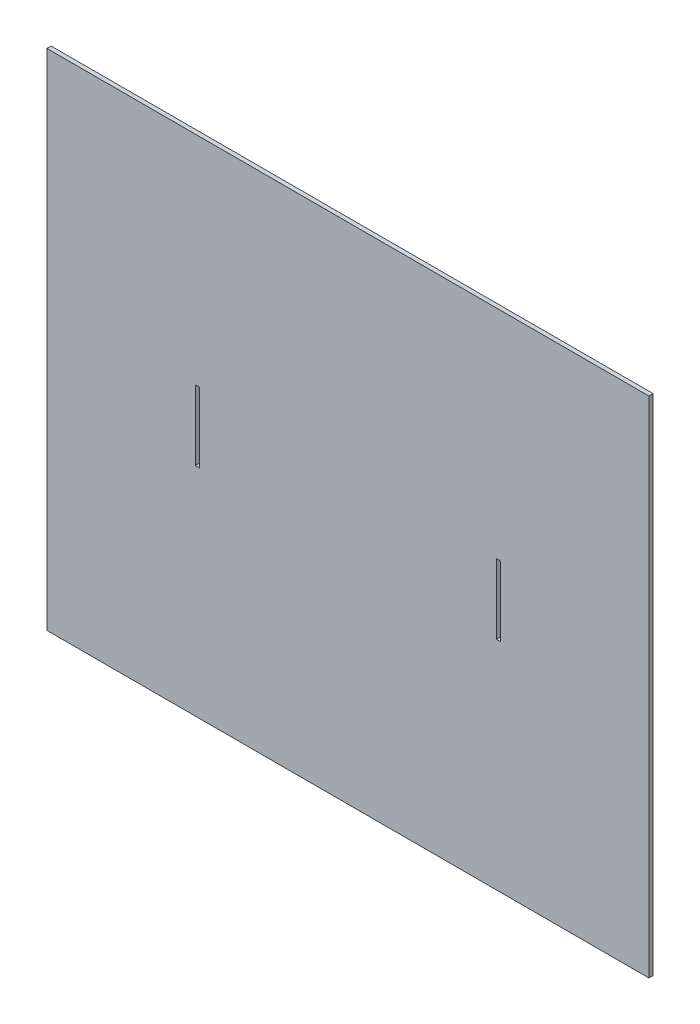
ISO-10303-21;
HEADER;
FILE_DESCRIPTION(('STEP AP214'),'2;1');
FILE_NAME('part.step','',(''),(''),'','','');
FILE_SCHEMA(('AUTOMOTIVE_DESIGN { 1 0 10303 214 1 1 1 1 }'));
ENDSEC;
DATA;
#1=APPLICATION_CONTEXT('core data for automotive mechanical design processes');
#2=APPLICATION_PROTOCOL_DEFINITION('international standard','automotive_design',2000,#1);
#3=PRODUCT_CONTEXT('',#1,'mechanical');
#4=PRODUCT('Part','Part','',(#3));
#5=PRODUCT_RELATED_PRODUCT_CATEGORY('part','',(#4));
#6=PRODUCT_DEFINITION_FORMATION('','',#4);
#7=PRODUCT_DEFINITION_CONTEXT('part definition',#1,'design');
#8=PRODUCT_DEFINITION('design','',#6,#7);
#9=PRODUCT_DEFINITION_SHAPE('','',#8);
#10=(LENGTH_UNIT() NAMED_UNIT(*) SI_UNIT(.MILLI.,.METRE.));
#11=(NAMED_UNIT(*) PLANE_ANGLE_UNIT() SI_UNIT($,.RADIAN.));
#12=(NAMED_UNIT(*) SI_UNIT($,.STERADIAN.) SOLID_ANGLE_UNIT());
#13=UNCERTAINTY_MEASURE_WITH_UNIT(LENGTH_MEASURE(1.E-05),#10,'distance_accuracy_value','');
#14=(GEOMETRIC_REPRESENTATION_CONTEXT(3) GLOBAL_UNCERTAINTY_ASSIGNED_CONTEXT((#13)) GLOBAL_UNIT_ASSIGNED_CONTEXT((#10,
#11,#12)) REPRESENTATION_CONTEXT('',''));
#15=CARTESIAN_POINT('',(0.,0.,0.));
#16=DIRECTION('',(0.,0.,1.));
#17=DIRECTION('',(1.,0.,0.));
#18=AXIS2_PLACEMENT_3D('',#15,#16,#17);
#19=CARTESIAN_POINT('',(0.,0.,3.));
#20=DIRECTION('',(0.,0.,-1.));
#21=DIRECTION('',(-1.,0.,0.));
#22=AXIS2_PLACEMENT_3D('',#19,#20,#21);
#23=PLANE('',#22);
#24=DIRECTION('',(0.,1.,0.));
#25=VECTOR('',#24,1.);
#26=CARTESIAN_POINT('',(109.,205.,3.));
#27=LINE('',#26,#25);
#28=CARTESIAN_POINT('',(109.,155.,3.));
#29=VERTEX_POINT('',#28);
#30=CARTESIAN_POINT('',(109.,205.,3.));
#31=VERTEX_POINT('',#30);
#32=EDGE_CURVE('E159',#29,#31,#27,.T.);
#33=ORIENTED_EDGE('',*,*,#32,.F.);
#34=DIRECTION('',(1.,0.,0.));
#35=VECTOR('',#34,1.);
#36=CARTESIAN_POINT('',(106.,155.,3.));
#37=LINE('',#36,#35);
#38=CARTESIAN_POINT('',(106.,155.,3.));
#39=VERTEX_POINT('',#38);
#40=EDGE_CURVE('E167',#39,#29,#37,.T.);
#41=ORIENTED_EDGE('',*,*,#40,.F.);
#42=DIRECTION('',(0.,-1.,0.));
#43=VECTOR('',#42,1.);
#44=CARTESIAN_POINT('',(106.,205.,3.));
#45=LINE('',#44,#43);
#46=CARTESIAN_POINT('',(106.,205.,3.));
#47=VERTEX_POINT('',#46);
#48=EDGE_CURVE('E164',#47,#39,#45,.T.);
#49=ORIENTED_EDGE('',*,*,#48,.F.);
#50=DIRECTION('',(-1.,0.,0.));
#51=VECTOR('',#50,1.);
#52=CARTESIAN_POINT('',(106.,205.,3.));
#53=LINE('',#52,#51);
#54=EDGE_CURVE('E161',#31,#47,#53,.T.);
#55=ORIENTED_EDGE('',*,*,#54,.F.);
#56=EDGE_LOOP('',(#33,#41,#49,#55));
#57=FACE_BOUND('',#56,.T.);
#58=DIRECTION('',(0.,-1.,0.));
#59=VECTOR('',#58,1.);
#60=CARTESIAN_POINT('',(0.,0.,3.));
#61=LINE('',#60,#59);
#62=CARTESIAN_POINT('',(0.,360.,3.));
#63=VERTEX_POINT('',#62);
#64=CARTESIAN_POINT('',(0.,0.,3.));
#65=VERTEX_POINT('',#64);
#66=EDGE_CURVE('E190',#63,#65,#61,.T.);
#67=ORIENTED_EDGE('',*,*,#66,.T.);
#68=DIRECTION('',(1.,0.,0.));
#69=VECTOR('',#68,1.);
#70=CARTESIAN_POINT('',(0.,0.,3.));
#71=LINE('',#70,#69);
#72=CARTESIAN_POINT('',(430.,0.,3.));
#73=VERTEX_POINT('',#72);
#74=EDGE_CURVE('E193',#65,#73,#71,.T.);
#75=ORIENTED_EDGE('',*,*,#74,.T.);
#76=DIRECTION('',(0.,1.,0.));
#77=VECTOR('',#76,1.);
#78=CARTESIAN_POINT('',(430.,0.,3.));
#79=LINE('',#78,#77);
#80=CARTESIAN_POINT('',(430.,360.,3.));
#81=VERTEX_POINT('',#80);
#82=EDGE_CURVE('E196',#73,#81,#79,.T.);
#83=ORIENTED_EDGE('',*,*,#82,.T.);
#84=DIRECTION('',(-1.,0.,0.));
#85=VECTOR('',#84,1.);
#86=CARTESIAN_POINT('',(0.,360.,3.));
#87=LINE('',#86,#85);
#88=EDGE_CURVE('E198',#81,#63,#87,.T.);
#89=ORIENTED_EDGE('',*,*,#88,.T.);
#90=EDGE_LOOP('',(#67,#75,#83,#89));
#91=FACE_BOUND('',#90,.T.);
#92=DIRECTION('',(0.,1.,0.));
#93=VECTOR('',#92,1.);
#94=CARTESIAN_POINT('',(324.,205.,3.));
#95=LINE('',#94,#93);
#96=CARTESIAN_POINT('',(324.,155.,3.));
#97=VERTEX_POINT('',#96);
#98=CARTESIAN_POINT('',(324.,205.,3.));
#99=VERTEX_POINT('',#98);
#100=EDGE_CURVE('E123',#97,#99,#95,.T.);
#101=ORIENTED_EDGE('',*,*,#100,.F.);
#102=DIRECTION('',(1.,0.,0.));
#103=VECTOR('',#102,1.);
#104=CARTESIAN_POINT('',(324.,155.,3.));
#105=LINE('',#104,#103);
#106=CARTESIAN_POINT('',(321.,155.,3.));
#107=VERTEX_POINT('',#106);
#108=EDGE_CURVE('E145',#107,#97,#105,.T.);
#109=ORIENTED_EDGE('',*,*,#108,.F.);
#110=DIRECTION('',(0.,-1.,0.));
#111=VECTOR('',#110,1.);
#112=CARTESIAN_POINT('',(321.,205.,3.));
#113=LINE('',#112,#111);
#114=CARTESIAN_POINT('',(321.,205.,3.));
#115=VERTEX_POINT('',#114);
#116=EDGE_CURVE('E143',#115,#107,#113,.T.);
#117=ORIENTED_EDGE('',*,*,#116,.F.);
#118=DIRECTION('',(-1.,0.,0.));
#119=VECTOR('',#118,1.);
#120=CARTESIAN_POINT('',(324.,205.,3.));
#121=LINE('',#120,#119);
#122=EDGE_CURVE('E131',#99,#115,#121,.T.);
#123=ORIENTED_EDGE('',*,*,#122,.F.);
#124=EDGE_LOOP('',(#101,#109,#117,#123));
#125=FACE_BOUND('',#124,.T.);
#126=ADVANCED_FACE('F34',(#57,#91,#125),#23,.F.);
#127=CARTESIAN_POINT('',(0.,0.,0.));
#128=DIRECTION('',(0.,0.,-1.));
#129=DIRECTION('',(-1.,0.,0.));
#130=AXIS2_PLACEMENT_3D('',#127,#128,#129);
#131=PLANE('',#130);
#132=DIRECTION('',(0.,-1.,0.));
#133=VECTOR('',#132,1.);
#134=CARTESIAN_POINT('',(0.,0.,0.));
#135=LINE('',#134,#133);
#136=CARTESIAN_POINT('',(0.,360.,0.));
#137=VERTEX_POINT('',#136);
#138=CARTESIAN_POINT('',(0.,0.,0.));
#139=VERTEX_POINT('',#138);
#140=EDGE_CURVE('E189',#137,#139,#135,.T.);
#141=ORIENTED_EDGE('',*,*,#140,.F.);
#142=DIRECTION('',(-1.,0.,0.));
#143=VECTOR('',#142,1.);
#144=CARTESIAN_POINT('',(0.,360.,0.));
#145=LINE('',#144,#143);
#146=CARTESIAN_POINT('',(430.,360.,0.));
#147=VERTEX_POINT('',#146);
#148=EDGE_CURVE('E194',#147,#137,#145,.T.);
#149=ORIENTED_EDGE('',*,*,#148,.F.);
#150=DIRECTION('',(0.,1.,0.));
#151=VECTOR('',#150,1.);
#152=CARTESIAN_POINT('',(430.,0.,0.));
#153=LINE('',#152,#151);
#154=CARTESIAN_POINT('',(430.,0.,0.));
#155=VERTEX_POINT('',#154);
#156=EDGE_CURVE('E205',#155,#147,#153,.T.);
#157=ORIENTED_EDGE('',*,*,#156,.F.);
#158=DIRECTION('',(1.,0.,0.));
#159=VECTOR('',#158,1.);
#160=CARTESIAN_POINT('',(0.,0.,0.));
#161=LINE('',#160,#159);
#162=EDGE_CURVE('E203',#139,#155,#161,.T.);
#163=ORIENTED_EDGE('',*,*,#162,.F.);
#164=EDGE_LOOP('',(#141,#149,#157,#163));
#165=FACE_BOUND('',#164,.T.);
#166=DIRECTION('',(1.,0.,0.));
#167=VECTOR('',#166,1.);
#168=CARTESIAN_POINT('',(106.,155.,0.));
#169=LINE('',#168,#167);
#170=CARTESIAN_POINT('',(106.,155.,0.));
#171=VERTEX_POINT('',#170);
#172=CARTESIAN_POINT('',(109.,155.,0.));
#173=VERTEX_POINT('',#172);
#174=EDGE_CURVE('E162',#171,#173,#169,.T.);
#175=ORIENTED_EDGE('',*,*,#174,.T.);
#176=DIRECTION('',(0.,1.,0.));
#177=VECTOR('',#176,1.);
#178=CARTESIAN_POINT('',(109.,205.,0.));
#179=LINE('',#178,#177);
#180=CARTESIAN_POINT('',(109.,205.,0.));
#181=VERTEX_POINT('',#180);
#182=EDGE_CURVE('E139',#173,#181,#179,.T.);
#183=ORIENTED_EDGE('',*,*,#182,.T.);
#184=DIRECTION('',(-1.,0.,0.));
#185=VECTOR('',#184,1.);
#186=CARTESIAN_POINT('',(106.,205.,0.));
#187=LINE('',#186,#185);
#188=CARTESIAN_POINT('',(106.,205.,0.));
#189=VERTEX_POINT('',#188);
#190=EDGE_CURVE('E172',#181,#189,#187,.T.);
#191=ORIENTED_EDGE('',*,*,#190,.T.);
#192=DIRECTION('',(0.,-1.,0.));
#193=VECTOR('',#192,1.);
#194=CARTESIAN_POINT('',(106.,205.,0.));
#195=LINE('',#194,#193);
#196=EDGE_CURVE('E175',#189,#171,#195,.T.);
#197=ORIENTED_EDGE('',*,*,#196,.T.);
#198=EDGE_LOOP('',(#175,#183,#191,#197));
#199=FACE_BOUND('',#198,.T.);
#200=DIRECTION('',(1.,0.,0.));
#201=VECTOR('',#200,1.);
#202=CARTESIAN_POINT('',(324.,155.,0.));
#203=LINE('',#202,#201);
#204=CARTESIAN_POINT('',(321.,155.,0.));
#205=VERTEX_POINT('',#204);
#206=CARTESIAN_POINT('',(324.,155.,0.));
#207=VERTEX_POINT('',#206);
#208=EDGE_CURVE('E132',#205,#207,#203,.T.);
#209=ORIENTED_EDGE('',*,*,#208,.T.);
#210=DIRECTION('',(0.,1.,0.));
#211=VECTOR('',#210,1.);
#212=CARTESIAN_POINT('',(324.,205.,0.));
#213=LINE('',#212,#211);
#214=CARTESIAN_POINT('',(324.,205.,0.));
#215=VERTEX_POINT('',#214);
#216=EDGE_CURVE('E57',#207,#215,#213,.T.);
#217=ORIENTED_EDGE('',*,*,#216,.T.);
#218=DIRECTION('',(-1.,0.,0.));
#219=VECTOR('',#218,1.);
#220=CARTESIAN_POINT('',(324.,205.,0.));
#221=LINE('',#220,#219);
#222=CARTESIAN_POINT('',(321.,205.,0.));
#223=VERTEX_POINT('',#222);
#224=EDGE_CURVE('E138',#215,#223,#221,.T.);
#225=ORIENTED_EDGE('',*,*,#224,.T.);
#226=DIRECTION('',(0.,-1.,0.));
#227=VECTOR('',#226,1.);
#228=CARTESIAN_POINT('',(321.,205.,0.));
#229=LINE('',#228,#227);
#230=EDGE_CURVE('E151',#223,#205,#229,.T.);
#231=ORIENTED_EDGE('',*,*,#230,.T.);
#232=EDGE_LOOP('',(#209,#217,#225,#231));
#233=FACE_BOUND('',#232,.T.);
#234=ADVANCED_FACE('F223',(#165,#199,#233),#131,.T.);
#235=CARTESIAN_POINT('',(0.,0.,3.));
#236=DIRECTION('',(1.,0.,0.));
#237=DIRECTION('',(0.,0.,-1.));
#238=AXIS2_PLACEMENT_3D('',#235,#236,#237);
#239=PLANE('',#238);
#240=ORIENTED_EDGE('',*,*,#140,.T.);
#241=DIRECTION('',(0.,0.,-1.));
#242=VECTOR('',#241,1.);
#243=CARTESIAN_POINT('',(0.,0.,3.));
#244=LINE('',#243,#242);
#245=EDGE_CURVE('E11',#65,#139,#244,.T.);
#246=ORIENTED_EDGE('',*,*,#245,.F.);
#247=ORIENTED_EDGE('',*,*,#66,.F.);
#248=DIRECTION('',(0.,0.,-1.));
#249=VECTOR('',#248,1.);
#250=CARTESIAN_POINT('',(0.,360.,3.));
#251=LINE('',#250,#249);
#252=EDGE_CURVE('E200',#63,#137,#251,.T.);
#253=ORIENTED_EDGE('',*,*,#252,.T.);
#254=EDGE_LOOP('',(#240,#246,#247,#253));
#255=FACE_BOUND('',#254,.T.);
#256=ADVANCED_FACE('F36',(#255),#239,.F.);
#257=CARTESIAN_POINT('',(0.,0.,3.));
#258=DIRECTION('',(0.,1.,0.));
#259=DIRECTION('',(0.,0.,1.));
#260=AXIS2_PLACEMENT_3D('',#257,#258,#259);
#261=PLANE('',#260);
#262=ORIENTED_EDGE('',*,*,#162,.T.);
#263=DIRECTION('',(0.,0.,-1.));
#264=VECTOR('',#263,1.);
#265=CARTESIAN_POINT('',(430.,0.,3.));
#266=LINE('',#265,#264);
#267=EDGE_CURVE('E42',#73,#155,#266,.T.);
#268=ORIENTED_EDGE('',*,*,#267,.F.);
#269=ORIENTED_EDGE('',*,*,#74,.F.);
#270=ORIENTED_EDGE('',*,*,#245,.T.);
#271=EDGE_LOOP('',(#262,#268,#269,#270));
#272=FACE_BOUND('',#271,.T.);
#273=ADVANCED_FACE('F233',(#272),#261,.F.);
#274=CARTESIAN_POINT('',(430.,0.,3.));
#275=DIRECTION('',(-1.,0.,0.));
#276=DIRECTION('',(0.,0.,1.));
#277=AXIS2_PLACEMENT_3D('',#274,#275,#276);
#278=PLANE('',#277);
#279=ORIENTED_EDGE('',*,*,#156,.T.);
#280=DIRECTION('',(0.,0.,-1.));
#281=VECTOR('',#280,1.);
#282=CARTESIAN_POINT('',(430.,360.,3.));
#283=LINE('',#282,#281);
#284=EDGE_CURVE('E210',#81,#147,#283,.T.);
#285=ORIENTED_EDGE('',*,*,#284,.F.);
#286=ORIENTED_EDGE('',*,*,#82,.F.);
#287=ORIENTED_EDGE('',*,*,#267,.T.);
#288=EDGE_LOOP('',(#279,#285,#286,#287));
#289=FACE_BOUND('',#288,.T.);
#290=ADVANCED_FACE('F217',(#289),#278,.F.);
#291=CARTESIAN_POINT('',(0.,360.,3.));
#292=DIRECTION('',(0.,-1.,0.));
#293=DIRECTION('',(0.,0.,-1.));
#294=AXIS2_PLACEMENT_3D('',#291,#292,#293);
#295=PLANE('',#294);
#296=ORIENTED_EDGE('',*,*,#148,.T.);
#297=ORIENTED_EDGE('',*,*,#252,.F.);
#298=ORIENTED_EDGE('',*,*,#88,.F.);
#299=ORIENTED_EDGE('',*,*,#284,.T.);
#300=EDGE_LOOP('',(#296,#297,#298,#299));
#301=FACE_BOUND('',#300,.T.);
#302=ADVANCED_FACE('F227',(#301),#295,.F.);
#303=CARTESIAN_POINT('',(109.,205.,3.));
#304=DIRECTION('',(-1.,0.,0.));
#305=DIRECTION('',(0.,0.,1.));
#306=AXIS2_PLACEMENT_3D('',#303,#304,#305);
#307=PLANE('',#306);
#308=ORIENTED_EDGE('',*,*,#182,.F.);
#309=DIRECTION('',(0.,0.,-1.));
#310=VECTOR('',#309,1.);
#311=CARTESIAN_POINT('',(109.,155.,3.));
#312=LINE('',#311,#310);
#313=EDGE_CURVE('E169',#29,#173,#312,.T.);
#314=ORIENTED_EDGE('',*,*,#313,.F.);
#315=ORIENTED_EDGE('',*,*,#32,.T.);
#316=DIRECTION('',(0.,0.,-1.));
#317=VECTOR('',#316,1.);
#318=CARTESIAN_POINT('',(109.,205.,3.));
#319=LINE('',#318,#317);
#320=EDGE_CURVE('E186',#31,#181,#319,.T.);
#321=ORIENTED_EDGE('',*,*,#320,.T.);
#322=EDGE_LOOP('',(#308,#314,#315,#321));
#323=FACE_BOUND('',#322,.T.);
#324=ADVANCED_FACE('F249',(#323),#307,.T.);
#325=CARTESIAN_POINT('',(106.,205.,3.));
#326=DIRECTION('',(0.,-1.,0.));
#327=DIRECTION('',(0.,0.,-1.));
#328=AXIS2_PLACEMENT_3D('',#325,#326,#327);
#329=PLANE('',#328);
#330=ORIENTED_EDGE('',*,*,#190,.F.);
#331=ORIENTED_EDGE('',*,*,#320,.F.);
#332=ORIENTED_EDGE('',*,*,#54,.T.);
#333=DIRECTION('',(0.,0.,-1.));
#334=VECTOR('',#333,1.);
#335=CARTESIAN_POINT('',(106.,205.,3.));
#336=LINE('',#335,#334);
#337=EDGE_CURVE('E184',#47,#189,#336,.T.);
#338=ORIENTED_EDGE('',*,*,#337,.T.);
#339=EDGE_LOOP('',(#330,#331,#332,#338));
#340=FACE_BOUND('',#339,.T.);
#341=ADVANCED_FACE('F256',(#340),#329,.T.);
#342=CARTESIAN_POINT('',(106.,205.,3.));
#343=DIRECTION('',(1.,0.,0.));
#344=DIRECTION('',(0.,0.,-1.));
#345=AXIS2_PLACEMENT_3D('',#342,#343,#344);
#346=PLANE('',#345);
#347=ORIENTED_EDGE('',*,*,#196,.F.);
#348=ORIENTED_EDGE('',*,*,#337,.F.);
#349=ORIENTED_EDGE('',*,*,#48,.T.);
#350=DIRECTION('',(0.,0.,-1.));
#351=VECTOR('',#350,1.);
#352=CARTESIAN_POINT('',(106.,155.,3.));
#353=LINE('',#352,#351);
#354=EDGE_CURVE('E182',#39,#171,#353,.T.);
#355=ORIENTED_EDGE('',*,*,#354,.T.);
#356=EDGE_LOOP('',(#347,#348,#349,#355));
#357=FACE_BOUND('',#356,.T.);
#358=ADVANCED_FACE('F261',(#357),#346,.T.);
#359=CARTESIAN_POINT('',(106.,155.,3.));
#360=DIRECTION('',(0.,1.,0.));
#361=DIRECTION('',(0.,0.,1.));
#362=AXIS2_PLACEMENT_3D('',#359,#360,#361);
#363=PLANE('',#362);
#364=ORIENTED_EDGE('',*,*,#174,.F.);
#365=ORIENTED_EDGE('',*,*,#354,.F.);
#366=ORIENTED_EDGE('',*,*,#40,.T.);
#367=ORIENTED_EDGE('',*,*,#313,.T.);
#368=EDGE_LOOP('',(#364,#365,#366,#367));
#369=FACE_BOUND('',#368,.T.);
#370=ADVANCED_FACE('F267',(#369),#363,.T.);
#371=CARTESIAN_POINT('',(324.,205.,3.));
#372=DIRECTION('',(-1.,0.,0.));
#373=DIRECTION('',(0.,0.,1.));
#374=AXIS2_PLACEMENT_3D('',#371,#372,#373);
#375=PLANE('',#374);
#376=ORIENTED_EDGE('',*,*,#216,.F.);
#377=DIRECTION('',(0.,0.,-1.));
#378=VECTOR('',#377,1.);
#379=CARTESIAN_POINT('',(324.,155.,3.));
#380=LINE('',#379,#378);
#381=EDGE_CURVE('E127',#97,#207,#380,.T.);
#382=ORIENTED_EDGE('',*,*,#381,.F.);
#383=ORIENTED_EDGE('',*,*,#100,.T.);
#384=DIRECTION('',(0.,0.,-1.));
#385=VECTOR('',#384,1.);
#386=CARTESIAN_POINT('',(324.,205.,3.));
#387=LINE('',#386,#385);
#388=EDGE_CURVE('E126',#99,#215,#387,.T.);
#389=ORIENTED_EDGE('',*,*,#388,.T.);
#390=EDGE_LOOP('',(#376,#382,#383,#389));
#391=FACE_BOUND('',#390,.T.);
#392=ADVANCED_FACE('F125',(#391),#375,.T.);
#393=CARTESIAN_POINT('',(324.,205.,3.));
#394=DIRECTION('',(0.,-1.,0.));
#395=DIRECTION('',(0.,0.,-1.));
#396=AXIS2_PLACEMENT_3D('',#393,#394,#395);
#397=PLANE('',#396);
#398=ORIENTED_EDGE('',*,*,#224,.F.);
#399=ORIENTED_EDGE('',*,*,#388,.F.);
#400=ORIENTED_EDGE('',*,*,#122,.T.);
#401=DIRECTION('',(0.,0.,-1.));
#402=VECTOR('',#401,1.);
#403=CARTESIAN_POINT('',(321.,205.,3.));
#404=LINE('',#403,#402);
#405=EDGE_CURVE('E140',#115,#223,#404,.T.);
#406=ORIENTED_EDGE('',*,*,#405,.T.);
#407=EDGE_LOOP('',(#398,#399,#400,#406));
#408=FACE_BOUND('',#407,.T.);
#409=ADVANCED_FACE('F135',(#408),#397,.T.);
#410=CARTESIAN_POINT('',(321.,205.,3.));
#411=DIRECTION('',(1.,0.,0.));
#412=DIRECTION('',(0.,0.,-1.));
#413=AXIS2_PLACEMENT_3D('',#410,#411,#412);
#414=PLANE('',#413);
#415=ORIENTED_EDGE('',*,*,#230,.F.);
#416=ORIENTED_EDGE('',*,*,#405,.F.);
#417=ORIENTED_EDGE('',*,*,#116,.T.);
#418=DIRECTION('',(0.,0.,-1.));
#419=VECTOR('',#418,1.);
#420=CARTESIAN_POINT('',(321.,155.,3.));
#421=LINE('',#420,#419);
#422=EDGE_CURVE('E49',#107,#205,#421,.T.);
#423=ORIENTED_EDGE('',*,*,#422,.T.);
#424=EDGE_LOOP('',(#415,#416,#417,#423));
#425=FACE_BOUND('',#424,.T.);
#426=ADVANCED_FACE('F286',(#425),#414,.T.);
#427=CARTESIAN_POINT('',(324.,155.,3.));
#428=DIRECTION('',(0.,1.,0.));
#429=DIRECTION('',(0.,0.,1.));
#430=AXIS2_PLACEMENT_3D('',#427,#428,#429);
#431=PLANE('',#430);
#432=ORIENTED_EDGE('',*,*,#208,.F.);
#433=ORIENTED_EDGE('',*,*,#422,.F.);
#434=ORIENTED_EDGE('',*,*,#108,.T.);
#435=ORIENTED_EDGE('',*,*,#381,.T.);
#436=EDGE_LOOP('',(#432,#433,#434,#435));
#437=FACE_BOUND('',#436,.T.);
#438=ADVANCED_FACE('F289',(#437),#431,.T.);
#439=CLOSED_SHELL('',(#126,#234,#256,#273,#290,#302,#324,#341,#358,#370,#392,#409,#426,#438));
#440=MANIFOLD_SOLID_BREP('B2',#439);
#441=ADVANCED_BREP_SHAPE_REPRESENTATION('',(#18,#440),#14);
#442=SHAPE_DEFINITION_REPRESENTATION(#9,#441);
ENDSEC;
END-ISO-10303-21;
